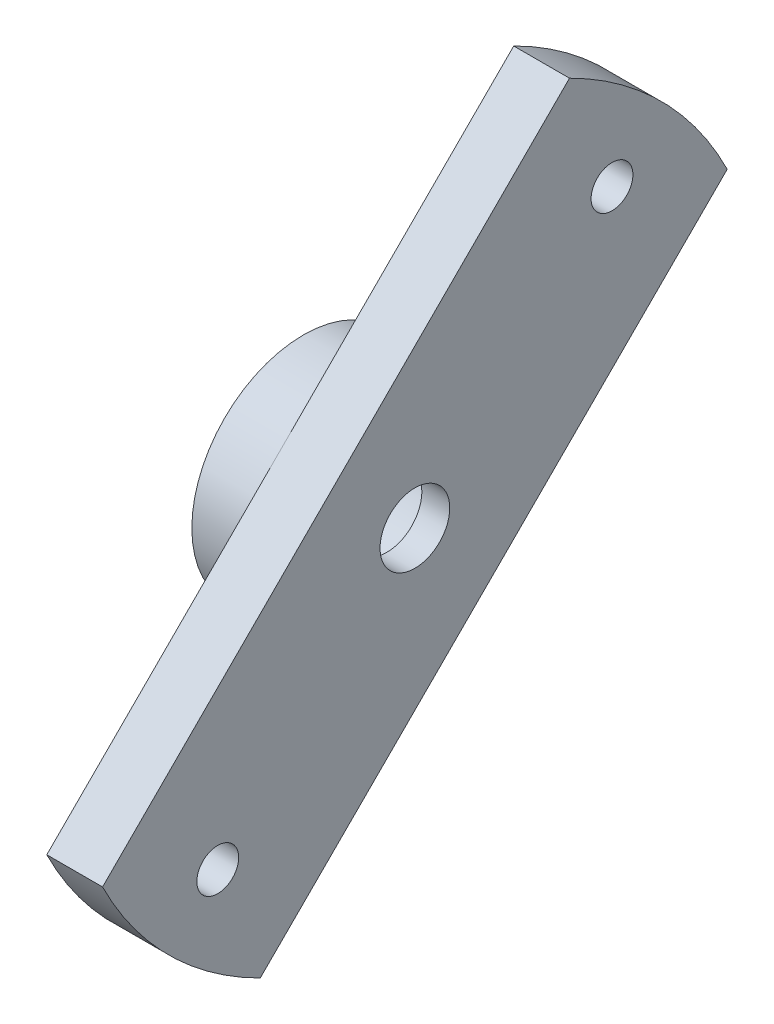
ISO-10303-21;
HEADER;
FILE_DESCRIPTION(('STEP AP214'),'2;1');
FILE_NAME('part.step','',(''),(''),'','','');
FILE_SCHEMA(('AUTOMOTIVE_DESIGN { 1 0 10303 214 1 1 1 1 }'));
ENDSEC;
DATA;
#1=APPLICATION_CONTEXT('core data for automotive mechanical design processes');
#2=APPLICATION_PROTOCOL_DEFINITION('international standard','automotive_design',2000,#1);
#3=PRODUCT_CONTEXT('',#1,'mechanical');
#4=PRODUCT('Part','Part','',(#3));
#5=PRODUCT_RELATED_PRODUCT_CATEGORY('part','',(#4));
#6=PRODUCT_DEFINITION_FORMATION('','',#4);
#7=PRODUCT_DEFINITION_CONTEXT('part definition',#1,'design');
#8=PRODUCT_DEFINITION('design','',#6,#7);
#9=PRODUCT_DEFINITION_SHAPE('','',#8);
#10=(LENGTH_UNIT() NAMED_UNIT(*) SI_UNIT(.MILLI.,.METRE.));
#11=(NAMED_UNIT(*) PLANE_ANGLE_UNIT() SI_UNIT($,.RADIAN.));
#12=(NAMED_UNIT(*) SI_UNIT($,.STERADIAN.) SOLID_ANGLE_UNIT());
#13=UNCERTAINTY_MEASURE_WITH_UNIT(LENGTH_MEASURE(1.E-05),#10,'distance_accuracy_value','');
#14=(GEOMETRIC_REPRESENTATION_CONTEXT(3) GLOBAL_UNCERTAINTY_ASSIGNED_CONTEXT((#13)) GLOBAL_UNIT_ASSIGNED_CONTEXT((#10,
#11,#12)) REPRESENTATION_CONTEXT('',''));
#15=CARTESIAN_POINT('',(0.,0.,0.));
#16=DIRECTION('',(0.,0.,1.));
#17=DIRECTION('',(1.,0.,0.));
#18=AXIS2_PLACEMENT_3D('',#15,#16,#17);
#19=CARTESIAN_POINT('',(-84.9999999999986,659.332012286207,-417.857743681072));
#20=DIRECTION('',(-1.,0.,0.));
#21=DIRECTION('',(0.,-1.,0.));
#22=AXIS2_PLACEMENT_3D('',#19,#20,#21);
#23=PLANE('',#22);
#24=CARTESIAN_POINT('',(-84.9999999999986,667.332012286207,-417.857743681072));
#25=DIRECTION('',(1.,0.,0.));
#26=DIRECTION('',(0.,0.,-1.));
#27=AXIS2_PLACEMENT_3D('',#24,#25,#26);
#28=CIRCLE('',#27,2.49999999999994);
#29=CARTESIAN_POINT('',(-84.9999999999986,667.332012286207,-420.357743681072));
#30=VERTEX_POINT('',#29);
#31=EDGE_CURVE('E69',#30,#30,#28,.T.);
#32=ORIENTED_EDGE('',*,*,#31,.T.);
#33=EDGE_LOOP('',(#32));
#34=FACE_BOUND('',#33,.T.);
#35=CARTESIAN_POINT('',(-84.9999999999986,667.332012286207,-417.857743681072));
#36=DIRECTION('',(1.,0.,0.));
#37=DIRECTION('',(0.,0.,-1.));
#38=AXIS2_PLACEMENT_3D('',#35,#36,#37);
#39=CIRCLE('',#38,4.00000000000004);
#40=CARTESIAN_POINT('',(-84.9999999999986,667.332012286207,-421.857743681072));
#41=VERTEX_POINT('',#40);
#42=EDGE_CURVE('E20',#41,#41,#39,.T.);
#43=ORIENTED_EDGE('',*,*,#42,.F.);
#44=EDGE_LOOP('',(#43));
#45=FACE_BOUND('',#44,.T.);
#46=ADVANCED_FACE('F17',(#34,#45),#23,.T.);
#47=CARTESIAN_POINT('',(-84.9999999999987,667.332012286207,-417.857743681072));
#48=DIRECTION('',(1.,0.,0.));
#49=DIRECTION('',(0.,0.,-1.));
#50=AXIS2_PLACEMENT_3D('',#47,#48,#49);
#51=CYLINDRICAL_SURFACE('',#50,4.00000000000004);
#52=ORIENTED_EDGE('',*,*,#42,.T.);
#53=EDGE_LOOP('',(#52));
#54=FACE_BOUND('',#53,.T.);
#55=CARTESIAN_POINT('',(-82.9999999999987,667.332012286207,-417.857743681072));
#56=DIRECTION('',(1.,0.,0.));
#57=DIRECTION('',(0.,0.,-1.));
#58=AXIS2_PLACEMENT_3D('',#55,#56,#57);
#59=CIRCLE('',#58,4.00000000000004);
#60=CARTESIAN_POINT('',(-82.9999999999987,664.503585161461,-420.686170805818));
#61=VERTEX_POINT('',#60);
#62=CARTESIAN_POINT('',(-82.9999999999987,670.160439410953,-415.029316556326));
#63=VERTEX_POINT('',#62);
#64=EDGE_CURVE('E64',#61,#63,#59,.T.);
#65=ORIENTED_EDGE('',*,*,#64,.F.);
#66=CARTESIAN_POINT('',(-82.9999999999987,667.332012286207,-417.857743681072));
#67=DIRECTION('',(1.,0.,0.));
#68=DIRECTION('',(0.,0.,-1.));
#69=AXIS2_PLACEMENT_3D('',#66,#67,#68);
#70=CIRCLE('',#69,4.00000000000004);
#71=EDGE_CURVE('E61',#63,#61,#70,.T.);
#72=ORIENTED_EDGE('',*,*,#71,.F.);
#73=EDGE_LOOP('',(#65,#72));
#74=FACE_BOUND('',#73,.T.);
#75=ADVANCED_FACE('F63',(#54,#74),#51,.T.);
#76=CARTESIAN_POINT('',(-84.9999999999987,667.332012286207,-417.857743681072));
#77=DIRECTION('',(1.,0.,0.));
#78=DIRECTION('',(0.,0.,-1.));
#79=AXIS2_PLACEMENT_3D('',#76,#77,#78);
#80=CYLINDRICAL_SURFACE('',#79,2.49999999999994);
#81=ORIENTED_EDGE('',*,*,#31,.F.);
#82=EDGE_LOOP('',(#81));
#83=FACE_BOUND('',#82,.T.);
#84=CARTESIAN_POINT('',(-81.9999999999987,667.332012286207,-417.857743681072));
#85=DIRECTION('',(1.,0.,0.));
#86=DIRECTION('',(0.,0.,-1.));
#87=AXIS2_PLACEMENT_3D('',#84,#85,#86);
#88=CIRCLE('',#87,2.49999999999994);
#89=CARTESIAN_POINT('',(-81.9999999999987,667.332012286207,-420.357743681072));
#90=VERTEX_POINT('',#89);
#91=EDGE_CURVE('E78',#90,#90,#88,.T.);
#92=ORIENTED_EDGE('',*,*,#91,.T.);
#93=EDGE_LOOP('',(#92));
#94=FACE_BOUND('',#93,.T.);
#95=ADVANCED_FACE('F138',(#83,#94),#80,.F.);
#96=CARTESIAN_POINT('',(-82.9999999999987,649.114057368382,-413.670710124961));
#97=DIRECTION('',(-1.,0.,0.));
#98=DIRECTION('',(0.,-1.,0.));
#99=AXIS2_PLACEMENT_3D('',#96,#97,#98);
#100=PLANE('',#99);
#101=CARTESIAN_POINT('',(-82.9999999999987,660.260944474342,-410.786675869207));
#102=DIRECTION('',(-1.,0.,0.));
#103=DIRECTION('',(0.,0.,1.));
#104=AXIS2_PLACEMENT_3D('',#101,#102,#103);
#105=CIRCLE('',#104,0.749999999999975);
#106=CARTESIAN_POINT('',(-82.9999999999987,660.260944474342,-410.036675869207));
#107=VERTEX_POINT('',#106);
#108=EDGE_CURVE('E121',#107,#107,#105,.F.);
#109=ORIENTED_EDGE('',*,*,#108,.T.);
#110=EDGE_LOOP('',(#109));
#111=FACE_BOUND('',#110,.T.);
#112=DIRECTION('',(0.,-0.707106781186546,0.707106781186549));
#113=VECTOR('',#112,1.);
#114=CARTESIAN_POINT('',(-82.9999999999987,656.129518049239,-412.312103693596));
#115=LINE('',#114,#113);
#116=CARTESIAN_POINT('',(-82.9999999999987,656.129518049239,-412.312103693596));
#117=VERTEX_POINT('',#116);
#118=EDGE_CURVE('E99',#61,#117,#115,.T.);
#119=ORIENTED_EDGE('',*,*,#118,.T.);
#120=CARTESIAN_POINT('',(-82.9999999999987,667.332012286207,-417.857743681072));
#121=DIRECTION('',(1.,0.,0.));
#122=DIRECTION('',(0.,0.,-1.));
#123=AXIS2_PLACEMENT_3D('',#120,#121,#122);
#124=CIRCLE('',#123,12.5);
#125=CARTESIAN_POINT('',(-82.9999999999987,661.786372298731,-406.655249444104));
#126=VERTEX_POINT('',#125);
#127=EDGE_CURVE('E84',#126,#117,#124,.T.);
#128=ORIENTED_EDGE('',*,*,#127,.F.);
#129=DIRECTION('',(0.,0.70710678118655,-0.707106781186545));
#130=VECTOR('',#129,1.);
#131=CARTESIAN_POINT('',(-82.9999999999987,678.534506523176,-423.403383668548));
#132=LINE('',#131,#130);
#133=EDGE_CURVE('E81',#126,#63,#132,.T.);
#134=ORIENTED_EDGE('',*,*,#133,.T.);
#135=ORIENTED_EDGE('',*,*,#71,.T.);
#136=EDGE_LOOP('',(#119,#128,#134,#135));
#137=FACE_BOUND('',#136,.T.);
#138=ADVANCED_FACE('F82',(#111,#137),#100,.T.);
#139=CARTESIAN_POINT('',(-82.9999999999987,657.488124480603,-422.044777237183));
#140=DIRECTION('',(-1.,0.,0.));
#141=DIRECTION('',(0.,-1.,0.));
#142=AXIS2_PLACEMENT_3D('',#139,#140,#141);
#143=PLANE('',#142);
#144=CARTESIAN_POINT('',(-82.9999999999987,674.403080098073,-424.928811492938));
#145=DIRECTION('',(-1.,0.,0.));
#146=DIRECTION('',(0.,0.,1.));
#147=AXIS2_PLACEMENT_3D('',#144,#145,#146);
#148=CIRCLE('',#147,0.750000000000012);
#149=CARTESIAN_POINT('',(-82.9999999999987,674.403080098073,-424.178811492938));
#150=VERTEX_POINT('',#149);
#151=EDGE_CURVE('E118',#150,#150,#148,.F.);
#152=ORIENTED_EDGE('',*,*,#151,.T.);
#153=EDGE_LOOP('',(#152));
#154=FACE_BOUND('',#153,.T.);
#155=DIRECTION('',(0.,-0.707106781186546,0.707106781186549));
#156=VECTOR('',#155,1.);
#157=CARTESIAN_POINT('',(-82.9999999999987,656.129518049239,-412.312103693596));
#158=LINE('',#157,#156);
#159=CARTESIAN_POINT('',(-82.9999999999987,672.877652273683,-429.06023791804));
#160=VERTEX_POINT('',#159);
#161=EDGE_CURVE('E77',#160,#61,#158,.T.);
#162=ORIENTED_EDGE('',*,*,#161,.T.);
#163=ORIENTED_EDGE('',*,*,#64,.T.);
#164=DIRECTION('',(0.,0.70710678118655,-0.707106781186545));
#165=VECTOR('',#164,1.);
#166=CARTESIAN_POINT('',(-82.9999999999987,678.534506523176,-423.403383668548));
#167=LINE('',#166,#165);
#168=CARTESIAN_POINT('',(-82.9999999999987,678.534506523175,-423.403383668548));
#169=VERTEX_POINT('',#168);
#170=EDGE_CURVE('E75',#63,#169,#167,.T.);
#171=ORIENTED_EDGE('',*,*,#170,.T.);
#172=CARTESIAN_POINT('',(-82.9999999999987,667.332012286207,-417.857743681072));
#173=DIRECTION('',(1.,0.,0.));
#174=DIRECTION('',(0.,0.,-1.));
#175=AXIS2_PLACEMENT_3D('',#172,#173,#174);
#176=CIRCLE('',#175,12.5);
#177=EDGE_CURVE('E124',#160,#169,#176,.T.);
#178=ORIENTED_EDGE('',*,*,#177,.F.);
#179=EDGE_LOOP('',(#162,#163,#171,#178));
#180=FACE_BOUND('',#179,.T.);
#181=ADVANCED_FACE('F72',(#154,#180),#143,.T.);
#182=CARTESIAN_POINT('',(-81.9999999999987,672.332012286207,-417.857743681072));
#183=DIRECTION('',(1.,0.,0.));
#184=DIRECTION('',(0.,0.,-1.));
#185=AXIS2_PLACEMENT_3D('',#182,#183,#184);
#186=PLANE('',#185);
#187=CARTESIAN_POINT('',(-81.9999999999987,667.332012286207,-417.857743681072));
#188=DIRECTION('',(1.,0.,0.));
#189=DIRECTION('',(0.,0.,-1.));
#190=AXIS2_PLACEMENT_3D('',#187,#188,#189);
#191=CIRCLE('',#190,1.25000000000004);
#192=CARTESIAN_POINT('',(-81.9999999999987,667.332012286207,-419.107743681072));
#193=VERTEX_POINT('',#192);
#194=EDGE_CURVE('E115',#193,#193,#191,.T.);
#195=ORIENTED_EDGE('',*,*,#194,.T.);
#196=EDGE_LOOP('',(#195));
#197=FACE_BOUND('',#196,.T.);
#198=ORIENTED_EDGE('',*,*,#91,.F.);
#199=EDGE_LOOP('',(#198));
#200=FACE_BOUND('',#199,.T.);
#201=ADVANCED_FACE('F172',(#197,#200),#186,.F.);
#202=CARTESIAN_POINT('',(-82.9999999999987,678.534506523176,-423.403383668548));
#203=DIRECTION('',(0.,-0.707106781186545,-0.70710678118655));
#204=DIRECTION('',(0.,0.70710678118655,-0.707106781186545));
#205=AXIS2_PLACEMENT_3D('',#202,#203,#204);
#206=PLANE('',#205);
#207=DIRECTION('',(1.,0.,0.));
#208=VECTOR('',#207,1.);
#209=CARTESIAN_POINT('',(-82.9999999999987,661.786372298731,-406.655249444104));
#210=LINE('',#209,#208);
#211=CARTESIAN_POINT('',(-80.9999999999986,661.786372298731,-406.655249444104));
#212=VERTEX_POINT('',#211);
#213=EDGE_CURVE('E87',#212,#126,#210,.F.);
#214=ORIENTED_EDGE('',*,*,#213,.F.);
#215=DIRECTION('',(0.,-0.707106781186549,0.707106781186546));
#216=VECTOR('',#215,1.);
#217=CARTESIAN_POINT('',(-80.9999999999987,678.534506523175,-423.403383668548));
#218=LINE('',#217,#216);
#219=CARTESIAN_POINT('',(-80.9999999999986,678.534506523175,-423.403383668548));
#220=VERTEX_POINT('',#219);
#221=EDGE_CURVE('E114',#220,#212,#218,.T.);
#222=ORIENTED_EDGE('',*,*,#221,.F.);
#223=DIRECTION('',(1.,0.,0.));
#224=VECTOR('',#223,1.);
#225=CARTESIAN_POINT('',(-82.9999999999987,678.534506523175,-423.403383668548));
#226=LINE('',#225,#224);
#227=EDGE_CURVE('E91',#169,#220,#226,.T.);
#228=ORIENTED_EDGE('',*,*,#227,.F.);
#229=ORIENTED_EDGE('',*,*,#170,.F.);
#230=ORIENTED_EDGE('',*,*,#133,.F.);
#231=EDGE_LOOP('',(#214,#222,#228,#229,#230));
#232=FACE_BOUND('',#231,.T.);
#233=ADVANCED_FACE('F89',(#232),#206,.F.);
#234=CARTESIAN_POINT('',(-82.9999999999987,667.332012286207,-417.857743681072));
#235=DIRECTION('',(1.,0.,0.));
#236=DIRECTION('',(0.,0.,-1.));
#237=AXIS2_PLACEMENT_3D('',#234,#235,#236);
#238=CYLINDRICAL_SURFACE('',#237,12.5);
#239=DIRECTION('',(1.,0.,0.));
#240=VECTOR('',#239,1.);
#241=CARTESIAN_POINT('',(-82.9999999999987,656.129518049239,-412.312103693596));
#242=LINE('',#241,#240);
#243=CARTESIAN_POINT('',(-80.9999999999986,656.129518049239,-412.312103693596));
#244=VERTEX_POINT('',#243);
#245=EDGE_CURVE('E100',#117,#244,#242,.T.);
#246=ORIENTED_EDGE('',*,*,#245,.T.);
#247=CARTESIAN_POINT('',(-80.9999999999986,667.332012286207,-417.857743681072));
#248=DIRECTION('',(1.,0.,0.));
#249=DIRECTION('',(0.,0.,-1.));
#250=AXIS2_PLACEMENT_3D('',#247,#248,#249);
#251=CIRCLE('',#250,12.5);
#252=EDGE_CURVE('E111',#212,#244,#251,.T.);
#253=ORIENTED_EDGE('',*,*,#252,.F.);
#254=ORIENTED_EDGE('',*,*,#213,.T.);
#255=ORIENTED_EDGE('',*,*,#127,.T.);
#256=EDGE_LOOP('',(#246,#253,#254,#255));
#257=FACE_BOUND('',#256,.T.);
#258=ADVANCED_FACE('F166',(#257),#238,.T.);
#259=CARTESIAN_POINT('',(-82.9999999999987,656.129518049239,-412.312103693596));
#260=DIRECTION('',(0.,0.707106781186549,0.707106781186546));
#261=DIRECTION('',(0.,-0.707106781186546,0.707106781186549));
#262=AXIS2_PLACEMENT_3D('',#259,#260,#261);
#263=PLANE('',#262);
#264=DIRECTION('',(0.,0.707106781186547,-0.707106781186547));
#265=VECTOR('',#264,1.);
#266=CARTESIAN_POINT('',(-80.9999999999987,656.129518049239,-412.312103693596));
#267=LINE('',#266,#265);
#268=CARTESIAN_POINT('',(-80.9999999999986,672.877652273683,-429.06023791804));
#269=VERTEX_POINT('',#268);
#270=EDGE_CURVE('E110',#244,#269,#267,.T.);
#271=ORIENTED_EDGE('',*,*,#270,.F.);
#272=ORIENTED_EDGE('',*,*,#245,.F.);
#273=ORIENTED_EDGE('',*,*,#118,.F.);
#274=ORIENTED_EDGE('',*,*,#161,.F.);
#275=DIRECTION('',(1.,0.,0.));
#276=VECTOR('',#275,1.);
#277=CARTESIAN_POINT('',(-82.9999999999987,672.877652273683,-429.06023791804));
#278=LINE('',#277,#276);
#279=EDGE_CURVE('E35',#269,#160,#278,.F.);
#280=ORIENTED_EDGE('',*,*,#279,.F.);
#281=EDGE_LOOP('',(#271,#272,#273,#274,#280));
#282=FACE_BOUND('',#281,.T.);
#283=ADVANCED_FACE('F162',(#282),#263,.F.);
#284=CARTESIAN_POINT('',(-82.9999999999987,667.332012286207,-417.857743681072));
#285=DIRECTION('',(1.,0.,0.));
#286=DIRECTION('',(0.,0.,-1.));
#287=AXIS2_PLACEMENT_3D('',#284,#285,#286);
#288=CYLINDRICAL_SURFACE('',#287,12.5);
#289=ORIENTED_EDGE('',*,*,#279,.T.);
#290=ORIENTED_EDGE('',*,*,#177,.T.);
#291=ORIENTED_EDGE('',*,*,#227,.T.);
#292=CARTESIAN_POINT('',(-80.9999999999986,667.332012286207,-417.857743681072));
#293=DIRECTION('',(1.,0.,0.));
#294=DIRECTION('',(0.,0.,-1.));
#295=AXIS2_PLACEMENT_3D('',#292,#293,#294);
#296=CIRCLE('',#295,12.5);
#297=EDGE_CURVE('E107',#269,#220,#296,.T.);
#298=ORIENTED_EDGE('',*,*,#297,.F.);
#299=EDGE_LOOP('',(#289,#290,#291,#298));
#300=FACE_BOUND('',#299,.T.);
#301=ADVANCED_FACE('F158',(#300),#288,.T.);
#302=CARTESIAN_POINT('',(-80.9999999999986,660.260944474342,-410.786675869207));
#303=DIRECTION('',(-1.,0.,0.));
#304=DIRECTION('',(0.,0.,1.));
#305=AXIS2_PLACEMENT_3D('',#302,#303,#304);
#306=CYLINDRICAL_SURFACE('',#305,0.749999999999975);
#307=ORIENTED_EDGE('',*,*,#108,.F.);
#308=EDGE_LOOP('',(#307));
#309=FACE_BOUND('',#308,.T.);
#310=CARTESIAN_POINT('',(-80.9999999999986,660.260944474342,-410.786675869207));
#311=DIRECTION('',(-1.,0.,0.));
#312=DIRECTION('',(0.,0.,1.));
#313=AXIS2_PLACEMENT_3D('',#310,#311,#312);
#314=CIRCLE('',#313,0.749999999999975);
#315=CARTESIAN_POINT('',(-80.9999999999986,660.260944474342,-410.036675869207));
#316=VERTEX_POINT('',#315);
#317=EDGE_CURVE('E104',#316,#316,#314,.T.);
#318=ORIENTED_EDGE('',*,*,#317,.F.);
#319=EDGE_LOOP('',(#318));
#320=FACE_BOUND('',#319,.T.);
#321=ADVANCED_FACE('F154',(#309,#320),#306,.F.);
#322=CARTESIAN_POINT('',(-80.9999999999986,674.403080098073,-424.928811492938));
#323=DIRECTION('',(-1.,0.,0.));
#324=DIRECTION('',(0.,0.,1.));
#325=AXIS2_PLACEMENT_3D('',#322,#323,#324);
#326=CYLINDRICAL_SURFACE('',#325,0.750000000000012);
#327=ORIENTED_EDGE('',*,*,#151,.F.);
#328=EDGE_LOOP('',(#327));
#329=FACE_BOUND('',#328,.T.);
#330=CARTESIAN_POINT('',(-80.9999999999986,674.403080098073,-424.928811492938));
#331=DIRECTION('',(-1.,0.,0.));
#332=DIRECTION('',(0.,0.,1.));
#333=AXIS2_PLACEMENT_3D('',#330,#331,#332);
#334=CIRCLE('',#333,0.750000000000012);
#335=CARTESIAN_POINT('',(-80.9999999999986,674.403080098073,-424.178811492938));
#336=VERTEX_POINT('',#335);
#337=EDGE_CURVE('E26',#336,#336,#334,.T.);
#338=ORIENTED_EDGE('',*,*,#337,.F.);
#339=EDGE_LOOP('',(#338));
#340=FACE_BOUND('',#339,.T.);
#341=ADVANCED_FACE('F147',(#329,#340),#326,.F.);
#342=CARTESIAN_POINT('',(-81.9999999999987,667.332012286207,-417.857743681072));
#343=DIRECTION('',(1.,0.,0.));
#344=DIRECTION('',(0.,0.,-1.));
#345=AXIS2_PLACEMENT_3D('',#342,#343,#344);
#346=CYLINDRICAL_SURFACE('',#345,1.25000000000004);
#347=ORIENTED_EDGE('',*,*,#194,.F.);
#348=EDGE_LOOP('',(#347));
#349=FACE_BOUND('',#348,.T.);
#350=CARTESIAN_POINT('',(-80.9999999999986,667.332012286207,-417.857743681072));
#351=DIRECTION('',(1.,0.,0.));
#352=DIRECTION('',(0.,0.,-1.));
#353=AXIS2_PLACEMENT_3D('',#350,#351,#352);
#354=CIRCLE('',#353,1.25000000000004);
#355=CARTESIAN_POINT('',(-80.9999999999986,667.332012286207,-419.107743681072));
#356=VERTEX_POINT('',#355);
#357=EDGE_CURVE('E11',#356,#356,#354,.F.);
#358=ORIENTED_EDGE('',*,*,#357,.F.);
#359=EDGE_LOOP('',(#358));
#360=FACE_BOUND('',#359,.T.);
#361=ADVANCED_FACE('F141',(#349,#360),#346,.F.);
#362=CARTESIAN_POINT('',(-80.9999999999987,667.332012286207,-395.452755207135));
#363=DIRECTION('',(1.,0.,0.));
#364=DIRECTION('',(0.,0.,-1.));
#365=AXIS2_PLACEMENT_3D('',#362,#363,#364);
#366=PLANE('',#365);
#367=ORIENTED_EDGE('',*,*,#357,.T.);
#368=EDGE_LOOP('',(#367));
#369=FACE_BOUND('',#368,.T.);
#370=ORIENTED_EDGE('',*,*,#337,.T.);
#371=EDGE_LOOP('',(#370));
#372=FACE_BOUND('',#371,.T.);
#373=ORIENTED_EDGE('',*,*,#317,.T.);
#374=EDGE_LOOP('',(#373));
#375=FACE_BOUND('',#374,.T.);
#376=ORIENTED_EDGE('',*,*,#270,.T.);
#377=ORIENTED_EDGE('',*,*,#297,.T.);
#378=ORIENTED_EDGE('',*,*,#221,.T.);
#379=ORIENTED_EDGE('',*,*,#252,.T.);
#380=EDGE_LOOP('',(#376,#377,#378,#379));
#381=FACE_BOUND('',#380,.T.);
#382=ADVANCED_FACE('F139',(#369,#372,#375,#381),#366,.T.);
#383=CLOSED_SHELL('',(#46,#75,#95,#138,#181,#201,#233,#258,#283,#301,#321,#341,#361,#382));
#384=MANIFOLD_SOLID_BREP('B1',#383);
#385=ADVANCED_BREP_SHAPE_REPRESENTATION('',(#18,#384),#14);
#386=SHAPE_DEFINITION_REPRESENTATION(#9,#385);
ENDSEC;
END-ISO-10303-21;
